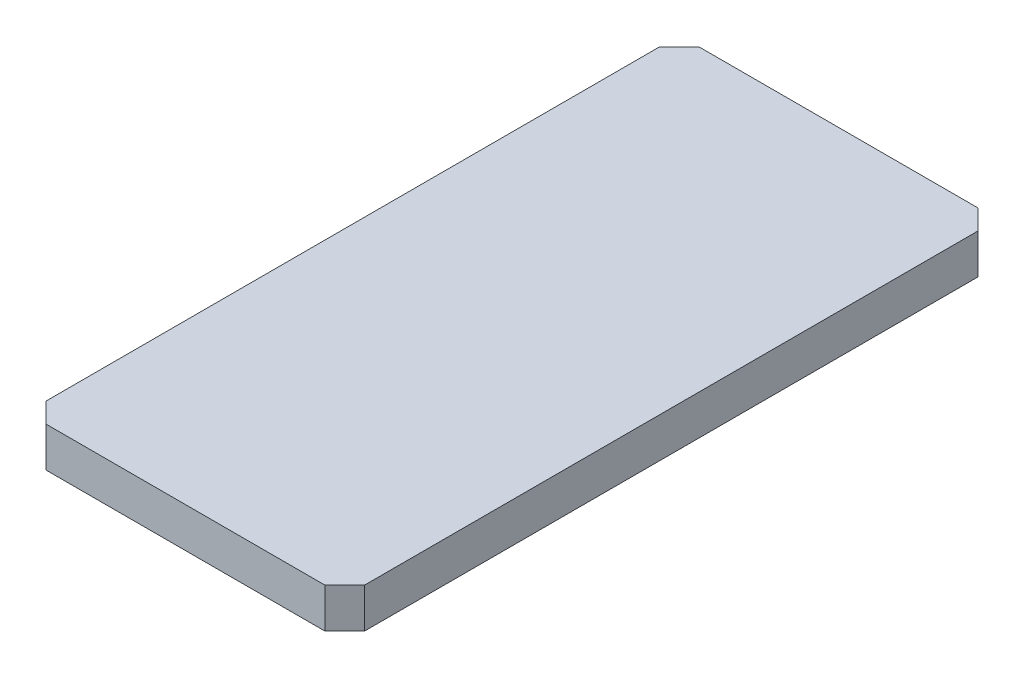
ISO-10303-21;
HEADER;
FILE_DESCRIPTION(('STEP AP214'),'2;1');
FILE_NAME('part.step','',(''),(''),'','','');
FILE_SCHEMA(('AUTOMOTIVE_DESIGN { 1 0 10303 214 1 1 1 1 }'));
ENDSEC;
DATA;
#1=APPLICATION_CONTEXT('core data for automotive mechanical design processes');
#2=APPLICATION_PROTOCOL_DEFINITION('international standard','automotive_design',2000,#1);
#3=PRODUCT_CONTEXT('',#1,'mechanical');
#4=PRODUCT('Part','Part','',(#3));
#5=PRODUCT_RELATED_PRODUCT_CATEGORY('part','',(#4));
#6=PRODUCT_DEFINITION_FORMATION('','',#4);
#7=PRODUCT_DEFINITION_CONTEXT('part definition',#1,'design');
#8=PRODUCT_DEFINITION('design','',#6,#7);
#9=PRODUCT_DEFINITION_SHAPE('','',#8);
#10=(LENGTH_UNIT() NAMED_UNIT(*) SI_UNIT(.MILLI.,.METRE.));
#11=(NAMED_UNIT(*) PLANE_ANGLE_UNIT() SI_UNIT($,.RADIAN.));
#12=(NAMED_UNIT(*) SI_UNIT($,.STERADIAN.) SOLID_ANGLE_UNIT());
#13=UNCERTAINTY_MEASURE_WITH_UNIT(LENGTH_MEASURE(1.E-05),#10,'distance_accuracy_value','');
#14=(GEOMETRIC_REPRESENTATION_CONTEXT(3) GLOBAL_UNCERTAINTY_ASSIGNED_CONTEXT((#13)) GLOBAL_UNIT_ASSIGNED_CONTEXT((#10,
#11,#12)) REPRESENTATION_CONTEXT('',''));
#15=CARTESIAN_POINT('',(0.,0.,0.));
#16=DIRECTION('',(0.,0.,1.));
#17=DIRECTION('',(1.,0.,0.));
#18=AXIS2_PLACEMENT_3D('',#15,#16,#17);
#19=CARTESIAN_POINT('',(0.,4.99999999999997,0.));
#20=DIRECTION('',(0.,0.,-1.));
#21=DIRECTION('',(-1.,0.,0.));
#22=AXIS2_PLACEMENT_3D('',#19,#20,#21);
#23=PLANE('',#22);
#24=DIRECTION('',(1.,0.,0.));
#25=VECTOR('',#24,1.);
#26=CARTESIAN_POINT('',(0.,0.,0.));
#27=LINE('',#26,#25);
#28=CARTESIAN_POINT('',(2.5,0.,0.));
#29=VERTEX_POINT('',#28);
#30=CARTESIAN_POINT('',(37.5,0.,0.));
#31=VERTEX_POINT('',#30);
#32=EDGE_CURVE('E133',#29,#31,#27,.T.);
#33=ORIENTED_EDGE('',*,*,#32,.T.);
#34=DIRECTION('',(0.,1.,0.));
#35=VECTOR('',#34,1.);
#36=CARTESIAN_POINT('',(37.5,4.99999999999997,0.));
#37=LINE('',#36,#35);
#38=CARTESIAN_POINT('',(37.5,4.99999999999997,0.));
#39=VERTEX_POINT('',#38);
#40=EDGE_CURVE('E44',#31,#39,#37,.T.);
#41=ORIENTED_EDGE('',*,*,#40,.T.);
#42=DIRECTION('',(1.,0.,0.));
#43=VECTOR('',#42,1.);
#44=CARTESIAN_POINT('',(0.,4.99999999999997,0.));
#45=LINE('',#44,#43);
#46=CARTESIAN_POINT('',(2.5,4.99999999999997,0.));
#47=VERTEX_POINT('',#46);
#48=EDGE_CURVE('E169',#47,#39,#45,.T.);
#49=ORIENTED_EDGE('',*,*,#48,.F.);
#50=DIRECTION('',(0.,-1.,0.));
#51=VECTOR('',#50,1.);
#52=CARTESIAN_POINT('',(2.5,0.,0.));
#53=LINE('',#52,#51);
#54=EDGE_CURVE('E206',#47,#29,#53,.T.);
#55=ORIENTED_EDGE('',*,*,#54,.T.);
#56=EDGE_LOOP('',(#33,#41,#49,#55));
#57=FACE_BOUND('',#56,.T.);
#58=ADVANCED_FACE('F35',(#57),#23,.F.);
#59=CARTESIAN_POINT('',(40.,4.99999999999997,0.));
#60=DIRECTION('',(-1.,0.,0.));
#61=DIRECTION('',(0.,0.,1.));
#62=AXIS2_PLACEMENT_3D('',#59,#60,#61);
#63=PLANE('',#62);
#64=DIRECTION('',(0.,0.,-1.));
#65=VECTOR('',#64,1.);
#66=CARTESIAN_POINT('',(40.,4.99999999999997,0.));
#67=LINE('',#66,#65);
#68=CARTESIAN_POINT('',(40.,4.99999999999997,-2.5));
#69=VERTEX_POINT('',#68);
#70=CARTESIAN_POINT('',(40.,4.99999999999997,-79.492065468643));
#71=VERTEX_POINT('',#70);
#72=EDGE_CURVE('E171',#69,#71,#67,.T.);
#73=ORIENTED_EDGE('',*,*,#72,.F.);
#74=DIRECTION('',(0.,-1.,0.));
#75=VECTOR('',#74,1.);
#76=CARTESIAN_POINT('',(40.,4.99999999999997,-2.5));
#77=LINE('',#76,#75);
#78=CARTESIAN_POINT('',(40.,0.,-2.5));
#79=VERTEX_POINT('',#78);
#80=EDGE_CURVE('E215',#69,#79,#77,.T.);
#81=ORIENTED_EDGE('',*,*,#80,.T.);
#82=DIRECTION('',(0.,0.,-1.));
#83=VECTOR('',#82,1.);
#84=CARTESIAN_POINT('',(40.,0.,0.));
#85=LINE('',#84,#83);
#86=CARTESIAN_POINT('',(40.,0.,-79.492065468643));
#87=VERTEX_POINT('',#86);
#88=EDGE_CURVE('E180',#79,#87,#85,.T.);
#89=ORIENTED_EDGE('',*,*,#88,.T.);
#90=DIRECTION('',(0.,1.,0.));
#91=VECTOR('',#90,1.);
#92=CARTESIAN_POINT('',(40.,4.99999999999997,-79.492065468643));
#93=LINE('',#92,#91);
#94=EDGE_CURVE('E190',#87,#71,#93,.T.);
#95=ORIENTED_EDGE('',*,*,#94,.T.);
#96=EDGE_LOOP('',(#73,#81,#89,#95));
#97=FACE_BOUND('',#96,.T.);
#98=ADVANCED_FACE('F231',(#97),#63,.F.);
#99=CARTESIAN_POINT('',(0.,4.99999999999997,-81.992065468643));
#100=DIRECTION('',(0.,0.,-1.));
#101=DIRECTION('',(-1.,0.,0.));
#102=AXIS2_PLACEMENT_3D('',#99,#100,#101);
#103=PLANE('',#102);
#104=DIRECTION('',(1.,0.,0.));
#105=VECTOR('',#104,1.);
#106=CARTESIAN_POINT('',(0.,0.,-81.992065468643));
#107=LINE('',#106,#105);
#108=CARTESIAN_POINT('',(2.50000000000003,0.,-81.992065468643));
#109=VERTEX_POINT('',#108);
#110=CARTESIAN_POINT('',(37.5,0.,-81.992065468643));
#111=VERTEX_POINT('',#110);
#112=EDGE_CURVE('E182',#109,#111,#107,.T.);
#113=ORIENTED_EDGE('',*,*,#112,.F.);
#114=DIRECTION('',(0.,1.,0.));
#115=VECTOR('',#114,1.);
#116=CARTESIAN_POINT('',(2.50000000000003,4.99999999999997,-81.992065468643));
#117=LINE('',#116,#115);
#118=CARTESIAN_POINT('',(2.50000000000003,4.99999999999997,-81.992065468643));
#119=VERTEX_POINT('',#118);
#120=EDGE_CURVE('E201',#109,#119,#117,.T.);
#121=ORIENTED_EDGE('',*,*,#120,.T.);
#122=DIRECTION('',(1.,0.,0.));
#123=VECTOR('',#122,1.);
#124=CARTESIAN_POINT('',(0.,4.99999999999997,-81.992065468643));
#125=LINE('',#124,#123);
#126=CARTESIAN_POINT('',(37.5,4.99999999999997,-81.992065468643));
#127=VERTEX_POINT('',#126);
#128=EDGE_CURVE('E174',#119,#127,#125,.T.);
#129=ORIENTED_EDGE('',*,*,#128,.T.);
#130=DIRECTION('',(0.,-1.,0.));
#131=VECTOR('',#130,1.);
#132=CARTESIAN_POINT('',(37.5,0.,-81.992065468643));
#133=LINE('',#132,#131);
#134=EDGE_CURVE('E178',#127,#111,#133,.T.);
#135=ORIENTED_EDGE('',*,*,#134,.T.);
#136=EDGE_LOOP('',(#113,#121,#129,#135));
#137=FACE_BOUND('',#136,.T.);
#138=ADVANCED_FACE('F255',(#137),#103,.T.);
#139=CARTESIAN_POINT('',(0.,4.99999999999997,0.));
#140=DIRECTION('',(-1.,0.,0.));
#141=DIRECTION('',(0.,0.,1.));
#142=AXIS2_PLACEMENT_3D('',#139,#140,#141);
#143=PLANE('',#142);
#144=DIRECTION('',(0.,0.,-1.));
#145=VECTOR('',#144,1.);
#146=CARTESIAN_POINT('',(0.,0.,0.));
#147=LINE('',#146,#145);
#148=CARTESIAN_POINT('',(0.,0.,-2.50000000000002));
#149=VERTEX_POINT('',#148);
#150=CARTESIAN_POINT('',(0.,0.,-79.492065468643));
#151=VERTEX_POINT('',#150);
#152=EDGE_CURVE('E172',#149,#151,#147,.T.);
#153=ORIENTED_EDGE('',*,*,#152,.F.);
#154=DIRECTION('',(0.,1.,0.));
#155=VECTOR('',#154,1.);
#156=CARTESIAN_POINT('',(0.,4.99999999999997,-2.50000000000002));
#157=LINE('',#156,#155);
#158=CARTESIAN_POINT('',(0.,4.99999999999997,-2.50000000000002));
#159=VERTEX_POINT('',#158);
#160=EDGE_CURVE('E211',#149,#159,#157,.T.);
#161=ORIENTED_EDGE('',*,*,#160,.T.);
#162=DIRECTION('',(0.,0.,-1.));
#163=VECTOR('',#162,1.);
#164=CARTESIAN_POINT('',(0.,4.99999999999997,0.));
#165=LINE('',#164,#163);
#166=CARTESIAN_POINT('',(0.,4.99999999999997,-79.492065468643));
#167=VERTEX_POINT('',#166);
#168=EDGE_CURVE('E176',#159,#167,#165,.T.);
#169=ORIENTED_EDGE('',*,*,#168,.T.);
#170=DIRECTION('',(0.,-1.,0.));
#171=VECTOR('',#170,1.);
#172=CARTESIAN_POINT('',(0.,4.99999999999997,-79.492065468643));
#173=LINE('',#172,#171);
#174=EDGE_CURVE('E196',#167,#151,#173,.T.);
#175=ORIENTED_EDGE('',*,*,#174,.T.);
#176=EDGE_LOOP('',(#153,#161,#169,#175));
#177=FACE_BOUND('',#176,.T.);
#178=ADVANCED_FACE('F249',(#177),#143,.T.);
#179=CARTESIAN_POINT('',(0.,4.99999999999997,0.));
#180=DIRECTION('',(0.,1.,0.));
#181=DIRECTION('',(0.,0.,1.));
#182=AXIS2_PLACEMENT_3D('',#179,#180,#181);
#183=PLANE('',#182);
#184=ORIENTED_EDGE('',*,*,#48,.T.);
#185=DIRECTION('',(-0.707106781186549,0.,0.707106781186546));
#186=VECTOR('',#185,1.);
#187=CARTESIAN_POINT('',(18.7499999999999,4.99999999999997,18.75));
#188=LINE('',#187,#186);
#189=EDGE_CURVE('E11',#39,#69,#188,.F.);
#190=ORIENTED_EDGE('',*,*,#189,.T.);
#191=ORIENTED_EDGE('',*,*,#72,.T.);
#192=DIRECTION('',(-0.707106781186546,0.,-0.707106781186549));
#193=VECTOR('',#192,1.);
#194=CARTESIAN_POINT('',(59.7460327343216,4.99999999999997,-59.7460327343213));
#195=LINE('',#194,#193);
#196=EDGE_CURVE('E193',#71,#127,#195,.T.);
#197=ORIENTED_EDGE('',*,*,#196,.T.);
#198=ORIENTED_EDGE('',*,*,#128,.F.);
#199=DIRECTION('',(0.707106781186549,0.,-0.707106781186546));
#200=VECTOR('',#199,1.);
#201=CARTESIAN_POINT('',(-39.7460327343215,4.99999999999997,-39.7460327343217));
#202=LINE('',#201,#200);
#203=EDGE_CURVE('E203',#119,#167,#202,.F.);
#204=ORIENTED_EDGE('',*,*,#203,.T.);
#205=ORIENTED_EDGE('',*,*,#168,.F.);
#206=DIRECTION('',(0.707106781186546,0.,0.707106781186549));
#207=VECTOR('',#206,1.);
#208=CARTESIAN_POINT('',(1.25000000000001,4.99999999999997,-1.25));
#209=LINE('',#208,#207);
#210=EDGE_CURVE('E213',#159,#47,#209,.T.);
#211=ORIENTED_EDGE('',*,*,#210,.T.);
#212=EDGE_LOOP('',(#184,#190,#191,#197,#198,#204,#205,#211));
#213=FACE_BOUND('',#212,.T.);
#214=ADVANCED_FACE('F229',(#213),#183,.T.);
#215=CARTESIAN_POINT('',(0.,0.,0.));
#216=DIRECTION('',(0.,1.,0.));
#217=DIRECTION('',(0.,0.,1.));
#218=AXIS2_PLACEMENT_3D('',#215,#216,#217);
#219=PLANE('',#218);
#220=DIRECTION('',(1.,0.,0.));
#221=VECTOR('',#220,1.);
#222=CARTESIAN_POINT('',(0.,0.,-62.992065468643));
#223=LINE('',#222,#221);
#224=CARTESIAN_POINT('',(7.5,0.,-62.992065468643));
#225=VERTEX_POINT('',#224);
#226=CARTESIAN_POINT('',(32.5,0.,-62.992065468643));
#227=VERTEX_POINT('',#226);
#228=EDGE_CURVE('E161',#225,#227,#223,.T.);
#229=ORIENTED_EDGE('',*,*,#228,.T.);
#230=CARTESIAN_POINT('',(32.5,0.,-69.992065468643));
#231=DIRECTION('',(0.,1.,0.));
#232=DIRECTION('',(0.,0.,1.));
#233=AXIS2_PLACEMENT_3D('',#230,#231,#232);
#234=CIRCLE('',#233,7.00000000000001);
#235=CARTESIAN_POINT('',(32.5,0.,-76.992065468643));
#236=VERTEX_POINT('',#235);
#237=EDGE_CURVE('E51',#236,#227,#234,.F.);
#238=ORIENTED_EDGE('',*,*,#237,.F.);
#239=DIRECTION('',(1.,0.,0.));
#240=VECTOR('',#239,1.);
#241=CARTESIAN_POINT('',(0.,0.,-76.992065468643));
#242=LINE('',#241,#240);
#243=CARTESIAN_POINT('',(7.5,0.,-76.992065468643));
#244=VERTEX_POINT('',#243);
#245=EDGE_CURVE('E132',#244,#236,#242,.T.);
#246=ORIENTED_EDGE('',*,*,#245,.F.);
#247=CARTESIAN_POINT('',(7.5,0.,-69.992065468643));
#248=DIRECTION('',(0.,1.,0.));
#249=DIRECTION('',(0.,0.,1.));
#250=AXIS2_PLACEMENT_3D('',#247,#248,#249);
#251=CIRCLE('',#250,7.00000000000001);
#252=EDGE_CURVE('E158',#244,#225,#251,.T.);
#253=ORIENTED_EDGE('',*,*,#252,.T.);
#254=EDGE_LOOP('',(#229,#238,#246,#253));
#255=FACE_BOUND('',#254,.T.);
#256=ORIENTED_EDGE('',*,*,#88,.F.);
#257=DIRECTION('',(0.707106781186549,0.,-0.707106781186546));
#258=VECTOR('',#257,1.);
#259=CARTESIAN_POINT('',(40.,0.,-2.5));
#260=LINE('',#259,#258);
#261=EDGE_CURVE('E218',#79,#31,#260,.F.);
#262=ORIENTED_EDGE('',*,*,#261,.T.);
#263=ORIENTED_EDGE('',*,*,#32,.F.);
#264=DIRECTION('',(-0.707106781186546,0.,-0.707106781186549));
#265=VECTOR('',#264,1.);
#266=CARTESIAN_POINT('',(2.5,0.,0.));
#267=LINE('',#266,#265);
#268=EDGE_CURVE('E209',#29,#149,#267,.T.);
#269=ORIENTED_EDGE('',*,*,#268,.T.);
#270=ORIENTED_EDGE('',*,*,#152,.T.);
#271=DIRECTION('',(-0.707106781186549,0.,0.707106781186546));
#272=VECTOR('',#271,1.);
#273=CARTESIAN_POINT('',(0.,0.,-79.492065468643));
#274=LINE('',#273,#272);
#275=EDGE_CURVE('E199',#151,#109,#274,.F.);
#276=ORIENTED_EDGE('',*,*,#275,.T.);
#277=ORIENTED_EDGE('',*,*,#112,.T.);
#278=DIRECTION('',(0.707106781186546,0.,0.707106781186549));
#279=VECTOR('',#278,1.);
#280=CARTESIAN_POINT('',(37.5,0.,-81.992065468643));
#281=LINE('',#280,#279);
#282=EDGE_CURVE('E187',#111,#87,#281,.T.);
#283=ORIENTED_EDGE('',*,*,#282,.T.);
#284=EDGE_LOOP('',(#256,#262,#263,#269,#270,#276,#277,#283));
#285=FACE_BOUND('',#284,.T.);
#286=ADVANCED_FACE('F222',(#255,#285),#219,.F.);
#287=CARTESIAN_POINT('',(37.5,4.99999999999997,-81.992065468643));
#288=DIRECTION('',(0.707106781186549,0.,-0.707106781186545));
#289=DIRECTION('',(0.,1.,0.));
#290=AXIS2_PLACEMENT_3D('',#287,#288,#289);
#291=PLANE('',#290);
#292=ORIENTED_EDGE('',*,*,#196,.F.);
#293=ORIENTED_EDGE('',*,*,#94,.F.);
#294=ORIENTED_EDGE('',*,*,#282,.F.);
#295=ORIENTED_EDGE('',*,*,#134,.F.);
#296=EDGE_LOOP('',(#292,#293,#294,#295));
#297=FACE_BOUND('',#296,.T.);
#298=ADVANCED_FACE('F237',(#297),#291,.T.);
#299=CARTESIAN_POINT('',(0.,4.99999999999997,-79.492065468643));
#300=DIRECTION('',(0.707106781186546,0.,0.707106781186549));
#301=DIRECTION('',(0.,-1.,0.));
#302=AXIS2_PLACEMENT_3D('',#299,#300,#301);
#303=PLANE('',#302);
#304=ORIENTED_EDGE('',*,*,#203,.F.);
#305=ORIENTED_EDGE('',*,*,#120,.F.);
#306=ORIENTED_EDGE('',*,*,#275,.F.);
#307=ORIENTED_EDGE('',*,*,#174,.F.);
#308=EDGE_LOOP('',(#304,#305,#306,#307));
#309=FACE_BOUND('',#308,.T.);
#310=ADVANCED_FACE('F245',(#309),#303,.F.);
#311=CARTESIAN_POINT('',(2.5,4.99999999999997,0.));
#312=DIRECTION('',(-0.707106781186549,0.,0.707106781186545));
#313=DIRECTION('',(0.,1.,0.));
#314=AXIS2_PLACEMENT_3D('',#311,#312,#313);
#315=PLANE('',#314);
#316=ORIENTED_EDGE('',*,*,#210,.F.);
#317=ORIENTED_EDGE('',*,*,#160,.F.);
#318=ORIENTED_EDGE('',*,*,#268,.F.);
#319=ORIENTED_EDGE('',*,*,#54,.F.);
#320=EDGE_LOOP('',(#316,#317,#318,#319));
#321=FACE_BOUND('',#320,.T.);
#322=ADVANCED_FACE('F253',(#321),#315,.T.);
#323=CARTESIAN_POINT('',(40.,4.99999999999997,-2.5));
#324=DIRECTION('',(-0.707106781186545,0.,-0.707106781186549));
#325=DIRECTION('',(0.,-1.,0.));
#326=AXIS2_PLACEMENT_3D('',#323,#324,#325);
#327=PLANE('',#326);
#328=ORIENTED_EDGE('',*,*,#189,.F.);
#329=ORIENTED_EDGE('',*,*,#40,.F.);
#330=ORIENTED_EDGE('',*,*,#261,.F.);
#331=ORIENTED_EDGE('',*,*,#80,.F.);
#332=EDGE_LOOP('',(#328,#329,#330,#331));
#333=FACE_BOUND('',#332,.T.);
#334=ADVANCED_FACE('F38',(#333),#327,.F.);
#335=CARTESIAN_POINT('',(32.5,0.5,-69.992065468643));
#336=DIRECTION('',(0.,-1.,0.));
#337=DIRECTION('',(0.,0.,-1.));
#338=AXIS2_PLACEMENT_3D('',#335,#336,#337);
#339=CYLINDRICAL_SURFACE('',#338,7.00000000000001);
#340=ORIENTED_EDGE('',*,*,#237,.T.);
#341=DIRECTION('',(0.,-1.,0.));
#342=VECTOR('',#341,1.);
#343=CARTESIAN_POINT('',(32.5,0.5,-62.992065468643));
#344=LINE('',#343,#342);
#345=CARTESIAN_POINT('',(32.5,0.5,-62.992065468643));
#346=VERTEX_POINT('',#345);
#347=EDGE_CURVE('E139',#346,#227,#344,.T.);
#348=ORIENTED_EDGE('',*,*,#347,.F.);
#349=CARTESIAN_POINT('',(32.5,0.5,-69.992065468643));
#350=DIRECTION('',(0.,1.,0.));
#351=DIRECTION('',(0.,0.,1.));
#352=AXIS2_PLACEMENT_3D('',#349,#350,#351);
#353=CIRCLE('',#352,7.00000000000001);
#354=CARTESIAN_POINT('',(32.5,0.5,-76.992065468643));
#355=VERTEX_POINT('',#354);
#356=EDGE_CURVE('E137',#355,#346,#353,.F.);
#357=ORIENTED_EDGE('',*,*,#356,.F.);
#358=DIRECTION('',(0.,-1.,0.));
#359=VECTOR('',#358,1.);
#360=CARTESIAN_POINT('',(32.5,0.5,-76.992065468643));
#361=LINE('',#360,#359);
#362=EDGE_CURVE('E126',#355,#236,#361,.T.);
#363=ORIENTED_EDGE('',*,*,#362,.T.);
#364=EDGE_LOOP('',(#340,#348,#357,#363));
#365=FACE_BOUND('',#364,.T.);
#366=ADVANCED_FACE('F138',(#365),#339,.F.);
#367=CARTESIAN_POINT('',(0.,0.5,-76.992065468643));
#368=DIRECTION('',(0.,0.,-1.));
#369=DIRECTION('',(-1.,0.,0.));
#370=AXIS2_PLACEMENT_3D('',#367,#368,#369);
#371=PLANE('',#370);
#372=ORIENTED_EDGE('',*,*,#245,.T.);
#373=ORIENTED_EDGE('',*,*,#362,.F.);
#374=DIRECTION('',(1.,0.,0.));
#375=VECTOR('',#374,1.);
#376=CARTESIAN_POINT('',(0.,0.5,-76.992065468643));
#377=LINE('',#376,#375);
#378=CARTESIAN_POINT('',(7.5,0.5,-76.992065468643));
#379=VERTEX_POINT('',#378);
#380=EDGE_CURVE('E130',#379,#355,#377,.T.);
#381=ORIENTED_EDGE('',*,*,#380,.F.);
#382=DIRECTION('',(0.,-1.,0.));
#383=VECTOR('',#382,1.);
#384=CARTESIAN_POINT('',(7.5,0.5,-76.992065468643));
#385=LINE('',#384,#383);
#386=EDGE_CURVE('E134',#379,#244,#385,.T.);
#387=ORIENTED_EDGE('',*,*,#386,.T.);
#388=EDGE_LOOP('',(#372,#373,#381,#387));
#389=FACE_BOUND('',#388,.T.);
#390=ADVANCED_FACE('F128',(#389),#371,.F.);
#391=CARTESIAN_POINT('',(7.5,0.5,-69.992065468643));
#392=DIRECTION('',(0.,-1.,0.));
#393=DIRECTION('',(0.,0.,-1.));
#394=AXIS2_PLACEMENT_3D('',#391,#392,#393);
#395=CYLINDRICAL_SURFACE('',#394,7.00000000000001);
#396=ORIENTED_EDGE('',*,*,#252,.F.);
#397=ORIENTED_EDGE('',*,*,#386,.F.);
#398=CARTESIAN_POINT('',(7.5,0.5,-69.992065468643));
#399=DIRECTION('',(0.,1.,0.));
#400=DIRECTION('',(0.,0.,1.));
#401=AXIS2_PLACEMENT_3D('',#398,#399,#400);
#402=CIRCLE('',#401,7.00000000000001);
#403=CARTESIAN_POINT('',(7.5,0.5,-62.992065468643));
#404=VERTEX_POINT('',#403);
#405=EDGE_CURVE('E146',#379,#404,#402,.T.);
#406=ORIENTED_EDGE('',*,*,#405,.T.);
#407=DIRECTION('',(0.,-1.,0.));
#408=VECTOR('',#407,1.);
#409=CARTESIAN_POINT('',(7.5,0.5,-62.992065468643));
#410=LINE('',#409,#408);
#411=EDGE_CURVE('E165',#404,#225,#410,.T.);
#412=ORIENTED_EDGE('',*,*,#411,.T.);
#413=EDGE_LOOP('',(#396,#397,#406,#412));
#414=FACE_BOUND('',#413,.T.);
#415=ADVANCED_FACE('F292',(#414),#395,.F.);
#416=CARTESIAN_POINT('',(36.4693612942979,0.5,-69.992065468643));
#417=DIRECTION('',(0.,-1.,0.));
#418=DIRECTION('',(0.,0.,-1.));
#419=AXIS2_PLACEMENT_3D('',#416,#417,#418);
#420=CYLINDRICAL_SURFACE('',#419,1.5);
#421=CARTESIAN_POINT('',(36.4693612942979,0.5,-69.992065468643));
#422=DIRECTION('',(0.,1.,0.));
#423=DIRECTION('',(0.,0.,1.));
#424=AXIS2_PLACEMENT_3D('',#421,#422,#423);
#425=CIRCLE('',#424,1.5);
#426=CARTESIAN_POINT('',(36.4693612942979,0.5,-68.492065468643));
#427=VERTEX_POINT('',#426);
#428=EDGE_CURVE('E141',#427,#427,#425,.T.);
#429=ORIENTED_EDGE('',*,*,#428,.F.);
#430=EDGE_LOOP('',(#429));
#431=FACE_BOUND('',#430,.T.);
#432=CARTESIAN_POINT('',(36.4693612942979,0.,-69.992065468643));
#433=DIRECTION('',(0.,1.,0.));
#434=DIRECTION('',(0.,0.,1.));
#435=AXIS2_PLACEMENT_3D('',#432,#433,#434);
#436=CIRCLE('',#435,1.5);
#437=CARTESIAN_POINT('',(36.4693612942979,0.,-68.492065468643));
#438=VERTEX_POINT('',#437);
#439=EDGE_CURVE('E153',#438,#438,#436,.T.);
#440=ORIENTED_EDGE('',*,*,#439,.T.);
#441=EDGE_LOOP('',(#440));
#442=FACE_BOUND('',#441,.T.);
#443=ADVANCED_FACE('F296',(#431,#442),#420,.T.);
#444=CARTESIAN_POINT('',(0.,0.5,-62.992065468643));
#445=DIRECTION('',(0.,0.,-1.));
#446=DIRECTION('',(-1.,0.,0.));
#447=AXIS2_PLACEMENT_3D('',#444,#445,#446);
#448=PLANE('',#447);
#449=ORIENTED_EDGE('',*,*,#228,.F.);
#450=ORIENTED_EDGE('',*,*,#411,.F.);
#451=DIRECTION('',(1.,0.,0.));
#452=VECTOR('',#451,1.);
#453=CARTESIAN_POINT('',(0.,0.5,-62.992065468643));
#454=LINE('',#453,#452);
#455=EDGE_CURVE('E148',#404,#346,#454,.T.);
#456=ORIENTED_EDGE('',*,*,#455,.T.);
#457=ORIENTED_EDGE('',*,*,#347,.T.);
#458=EDGE_LOOP('',(#449,#450,#456,#457));
#459=FACE_BOUND('',#458,.T.);
#460=ADVANCED_FACE('F299',(#459),#448,.T.);
#461=CARTESIAN_POINT('',(0.,0.5,0.));
#462=DIRECTION('',(0.,1.,0.));
#463=DIRECTION('',(0.,0.,1.));
#464=AXIS2_PLACEMENT_3D('',#461,#462,#463);
#465=PLANE('',#464);
#466=ORIENTED_EDGE('',*,*,#428,.T.);
#467=EDGE_LOOP('',(#466));
#468=FACE_BOUND('',#467,.T.);
#469=ORIENTED_EDGE('',*,*,#356,.T.);
#470=ORIENTED_EDGE('',*,*,#455,.F.);
#471=ORIENTED_EDGE('',*,*,#405,.F.);
#472=ORIENTED_EDGE('',*,*,#380,.T.);
#473=EDGE_LOOP('',(#469,#470,#471,#472));
#474=FACE_BOUND('',#473,.T.);
#475=ADVANCED_FACE('F144',(#468,#474),#465,.F.);
#476=ORIENTED_EDGE('',*,*,#439,.F.);
#477=EDGE_LOOP('',(#476));
#478=FACE_BOUND('',#477,.T.);
#479=ADVANCED_FACE('F305',(#478),#219,.F.);
#480=CLOSED_SHELL('',(#58,#98,#138,#178,#214,#286,#298,#310,#322,#334,#366,#390,#415,#443,#460,
#475,#479));
#481=MANIFOLD_SOLID_BREP('B2',#480);
#482=ADVANCED_BREP_SHAPE_REPRESENTATION('',(#18,#481),#14);
#483=SHAPE_DEFINITION_REPRESENTATION(#9,#482);
ENDSEC;
END-ISO-10303-21;
